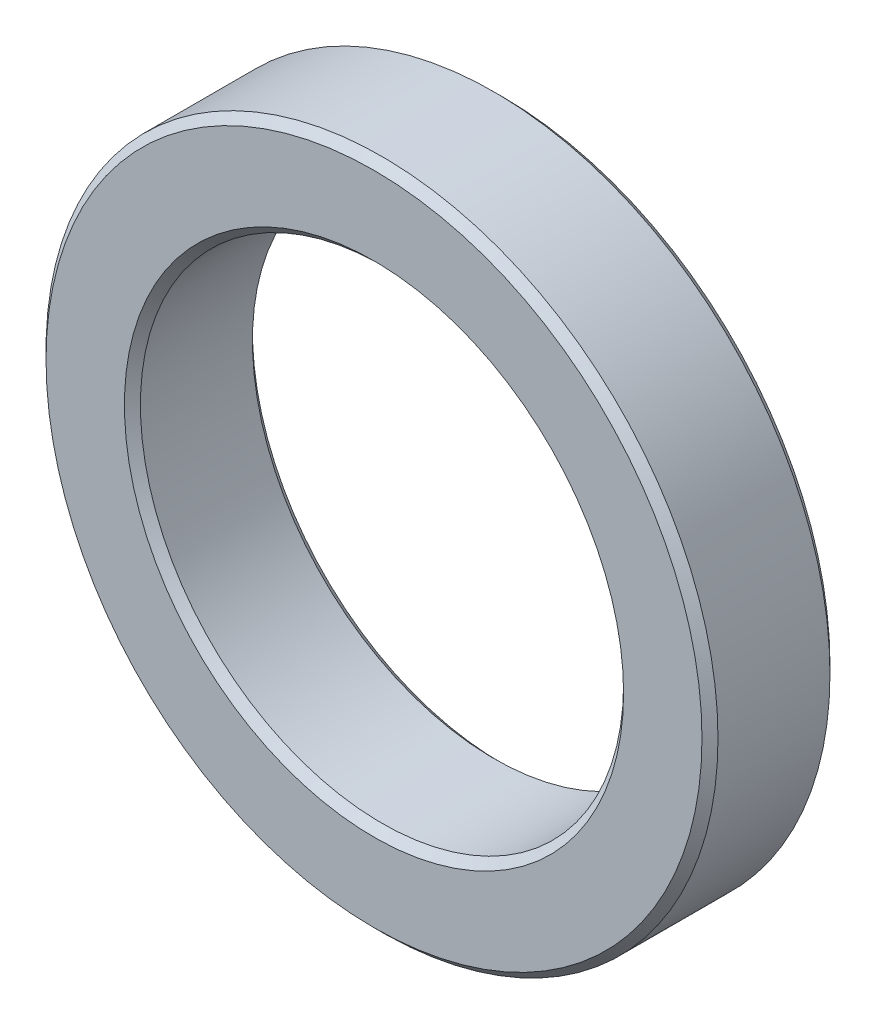
ISO-10303-21;
HEADER;
FILE_DESCRIPTION(('STEP AP214'),'2;1');
FILE_NAME('part.step','',(''),(''),'','','');
FILE_SCHEMA(('AUTOMOTIVE_DESIGN { 1 0 10303 214 1 1 1 1 }'));
ENDSEC;
DATA;
#1=APPLICATION_CONTEXT('core data for automotive mechanical design processes');
#2=APPLICATION_PROTOCOL_DEFINITION('international standard','automotive_design',2000,#1);
#3=PRODUCT_CONTEXT('',#1,'mechanical');
#4=PRODUCT('Part','Part','',(#3));
#5=PRODUCT_RELATED_PRODUCT_CATEGORY('part','',(#4));
#6=PRODUCT_DEFINITION_FORMATION('','',#4);
#7=PRODUCT_DEFINITION_CONTEXT('part definition',#1,'design');
#8=PRODUCT_DEFINITION('design','',#6,#7);
#9=PRODUCT_DEFINITION_SHAPE('','',#8);
#10=(LENGTH_UNIT() NAMED_UNIT(*) SI_UNIT(.MILLI.,.METRE.));
#11=(NAMED_UNIT(*) PLANE_ANGLE_UNIT() SI_UNIT($,.RADIAN.));
#12=(NAMED_UNIT(*) SI_UNIT($,.STERADIAN.) SOLID_ANGLE_UNIT());
#13=UNCERTAINTY_MEASURE_WITH_UNIT(LENGTH_MEASURE(1.E-05),#10,'distance_accuracy_value','');
#14=(GEOMETRIC_REPRESENTATION_CONTEXT(3) GLOBAL_UNCERTAINTY_ASSIGNED_CONTEXT((#13)) GLOBAL_UNIT_ASSIGNED_CONTEXT((#10,
#11,#12)) REPRESENTATION_CONTEXT('',''));
#15=CARTESIAN_POINT('',(0.,0.,0.));
#16=DIRECTION('',(0.,0.,1.));
#17=DIRECTION('',(1.,0.,0.));
#18=AXIS2_PLACEMENT_3D('',#15,#16,#17);
#19=CARTESIAN_POINT('',(0.,0.,4.));
#20=DIRECTION('',(0.,0.,1.));
#21=DIRECTION('',(1.,0.,0.));
#22=AXIS2_PLACEMENT_3D('',#19,#20,#21);
#23=PLANE('',#22);
#24=CARTESIAN_POINT('',(0.,0.,4.));
#25=DIRECTION('',(0.,0.,1.));
#26=DIRECTION('',(1.,0.,0.));
#27=AXIS2_PLACEMENT_3D('',#24,#25,#26);
#28=CIRCLE('',#27,15.6);
#29=CARTESIAN_POINT('',(15.6,0.,4.));
#30=VERTEX_POINT('',#29);
#31=EDGE_CURVE('E46',#30,#30,#28,.F.);
#32=ORIENTED_EDGE('',*,*,#31,.T.);
#33=EDGE_LOOP('',(#32));
#34=FACE_BOUND('',#33,.T.);
#35=CARTESIAN_POINT('',(0.,0.,4.));
#36=DIRECTION('',(0.,0.,1.));
#37=DIRECTION('',(1.,0.,0.));
#38=AXIS2_PLACEMENT_3D('',#35,#36,#37);
#39=CIRCLE('',#38,20.5);
#40=CARTESIAN_POINT('',(20.5,0.,4.));
#41=VERTEX_POINT('',#40);
#42=EDGE_CURVE('E50',#41,#41,#39,.T.);
#43=ORIENTED_EDGE('',*,*,#42,.T.);
#44=EDGE_LOOP('',(#43));
#45=FACE_BOUND('',#44,.T.);
#46=ADVANCED_FACE('F35',(#34,#45),#23,.T.);
#47=CARTESIAN_POINT('',(0.,0.,-4.));
#48=DIRECTION('',(0.,0.,1.));
#49=DIRECTION('',(1.,0.,0.));
#50=AXIS2_PLACEMENT_3D('',#47,#48,#49);
#51=PLANE('',#50);
#52=CARTESIAN_POINT('',(0.,0.,-4.));
#53=DIRECTION('',(0.,0.,1.));
#54=DIRECTION('',(1.,0.,0.));
#55=AXIS2_PLACEMENT_3D('',#52,#53,#54);
#56=CIRCLE('',#55,15.6);
#57=CARTESIAN_POINT('',(15.6,0.,-4.));
#58=VERTEX_POINT('',#57);
#59=EDGE_CURVE('E61',#58,#58,#56,.T.);
#60=ORIENTED_EDGE('',*,*,#59,.T.);
#61=EDGE_LOOP('',(#60));
#62=FACE_BOUND('',#61,.T.);
#63=CARTESIAN_POINT('',(0.,0.,-4.));
#64=DIRECTION('',(0.,0.,1.));
#65=DIRECTION('',(1.,0.,0.));
#66=AXIS2_PLACEMENT_3D('',#63,#64,#65);
#67=CIRCLE('',#66,20.5);
#68=CARTESIAN_POINT('',(20.5,0.,-4.));
#69=VERTEX_POINT('',#68);
#70=EDGE_CURVE('E64',#69,#69,#67,.F.);
#71=ORIENTED_EDGE('',*,*,#70,.T.);
#72=EDGE_LOOP('',(#71));
#73=FACE_BOUND('',#72,.T.);
#74=ADVANCED_FACE('F68',(#62,#73),#51,.F.);
#75=CARTESIAN_POINT('',(0.,0.,4.));
#76=DIRECTION('',(0.,0.,-1.));
#77=DIRECTION('',(-1.,0.,0.));
#78=AXIS2_PLACEMENT_3D('',#75,#76,#77);
#79=CYLINDRICAL_SURFACE('',#78,21.);
#80=CARTESIAN_POINT('',(0.,0.,-3.49999999999999));
#81=DIRECTION('',(0.,0.,1.));
#82=DIRECTION('',(1.,0.,0.));
#83=AXIS2_PLACEMENT_3D('',#80,#81,#82);
#84=CIRCLE('',#83,21.);
#85=CARTESIAN_POINT('',(21.,0.,-3.49999999999999));
#86=VERTEX_POINT('',#85);
#87=EDGE_CURVE('E10',#86,#86,#84,.T.);
#88=ORIENTED_EDGE('',*,*,#87,.T.);
#89=EDGE_LOOP('',(#88));
#90=FACE_BOUND('',#89,.T.);
#91=CARTESIAN_POINT('',(0.,0.,3.5));
#92=DIRECTION('',(0.,0.,1.));
#93=DIRECTION('',(1.,0.,0.));
#94=AXIS2_PLACEMENT_3D('',#91,#92,#93);
#95=CIRCLE('',#94,21.);
#96=CARTESIAN_POINT('',(21.,0.,3.5));
#97=VERTEX_POINT('',#96);
#98=EDGE_CURVE('E42',#97,#97,#95,.F.);
#99=ORIENTED_EDGE('',*,*,#98,.T.);
#100=EDGE_LOOP('',(#99));
#101=FACE_BOUND('',#100,.T.);
#102=ADVANCED_FACE('F88',(#90,#101),#79,.T.);
#103=CARTESIAN_POINT('',(0.,0.,4.));
#104=DIRECTION('',(0.,0.,-1.));
#105=DIRECTION('',(-1.,0.,0.));
#106=AXIS2_PLACEMENT_3D('',#103,#104,#105);
#107=CYLINDRICAL_SURFACE('',#106,15.1);
#108=CARTESIAN_POINT('',(0.,0.,-3.50000000000001));
#109=DIRECTION('',(0.,0.,1.));
#110=DIRECTION('',(1.,0.,0.));
#111=AXIS2_PLACEMENT_3D('',#108,#109,#110);
#112=CIRCLE('',#111,15.1);
#113=CARTESIAN_POINT('',(15.1,0.,-3.50000000000001));
#114=VERTEX_POINT('',#113);
#115=EDGE_CURVE('E55',#114,#114,#112,.F.);
#116=ORIENTED_EDGE('',*,*,#115,.T.);
#117=EDGE_LOOP('',(#116));
#118=FACE_BOUND('',#117,.T.);
#119=CARTESIAN_POINT('',(0.,0.,3.50000000000001));
#120=DIRECTION('',(0.,0.,1.));
#121=DIRECTION('',(1.,0.,0.));
#122=AXIS2_PLACEMENT_3D('',#119,#120,#121);
#123=CIRCLE('',#122,15.1);
#124=CARTESIAN_POINT('',(15.1,0.,3.50000000000001));
#125=VERTEX_POINT('',#124);
#126=EDGE_CURVE('E58',#125,#125,#123,.T.);
#127=ORIENTED_EDGE('',*,*,#126,.T.);
#128=EDGE_LOOP('',(#127));
#129=FACE_BOUND('',#128,.T.);
#130=ADVANCED_FACE('F93',(#118,#129),#107,.F.);
#131=CARTESIAN_POINT('',(0.,0.,-4.));
#132=DIRECTION('',(0.,0.,-1.));
#133=DIRECTION('',(-1.,0.,0.));
#134=AXIS2_PLACEMENT_3D('',#131,#132,#133);
#135=CONICAL_SURFACE('',#134,15.6,0.785398163397448);
#136=ORIENTED_EDGE('',*,*,#115,.F.);
#137=EDGE_LOOP('',(#136));
#138=FACE_BOUND('',#137,.T.);
#139=ORIENTED_EDGE('',*,*,#59,.F.);
#140=EDGE_LOOP('',(#139));
#141=FACE_BOUND('',#140,.T.);
#142=ADVANCED_FACE('F79',(#138,#141),#135,.F.);
#143=CARTESIAN_POINT('',(0.,0.,3.50000000000001));
#144=DIRECTION('',(0.,0.,1.));
#145=DIRECTION('',(1.,0.,0.));
#146=AXIS2_PLACEMENT_3D('',#143,#144,#145);
#147=CONICAL_SURFACE('',#146,15.1,0.785398163397452);
#148=ORIENTED_EDGE('',*,*,#31,.F.);
#149=EDGE_LOOP('',(#148));
#150=FACE_BOUND('',#149,.T.);
#151=ORIENTED_EDGE('',*,*,#126,.F.);
#152=EDGE_LOOP('',(#151));
#153=FACE_BOUND('',#152,.T.);
#154=ADVANCED_FACE('F73',(#150,#153),#147,.F.);
#155=CARTESIAN_POINT('',(0.,0.,-3.49999999999999));
#156=DIRECTION('',(0.,0.,1.));
#157=DIRECTION('',(1.,0.,0.));
#158=AXIS2_PLACEMENT_3D('',#155,#156,#157);
#159=CONICAL_SURFACE('',#158,21.,0.785398163397452);
#160=ORIENTED_EDGE('',*,*,#70,.F.);
#161=EDGE_LOOP('',(#160));
#162=FACE_BOUND('',#161,.T.);
#163=ORIENTED_EDGE('',*,*,#87,.F.);
#164=EDGE_LOOP('',(#163));
#165=FACE_BOUND('',#164,.T.);
#166=ADVANCED_FACE('F70',(#162,#165),#159,.T.);
#167=CARTESIAN_POINT('',(0.,0.,4.));
#168=DIRECTION('',(0.,0.,-1.));
#169=DIRECTION('',(-1.,0.,0.));
#170=AXIS2_PLACEMENT_3D('',#167,#168,#169);
#171=CONICAL_SURFACE('',#170,20.5,0.785398163397441);
#172=ORIENTED_EDGE('',*,*,#98,.F.);
#173=EDGE_LOOP('',(#172));
#174=FACE_BOUND('',#173,.T.);
#175=ORIENTED_EDGE('',*,*,#42,.F.);
#176=EDGE_LOOP('',(#175));
#177=FACE_BOUND('',#176,.T.);
#178=ADVANCED_FACE('F37',(#174,#177),#171,.T.);
#179=CLOSED_SHELL('',(#46,#74,#102,#130,#142,#154,#166,#178));
#180=MANIFOLD_SOLID_BREP('B2',#179);
#181=ADVANCED_BREP_SHAPE_REPRESENTATION('',(#18,#180),#14);
#182=SHAPE_DEFINITION_REPRESENTATION(#9,#181);
ENDSEC;
END-ISO-10303-21;
